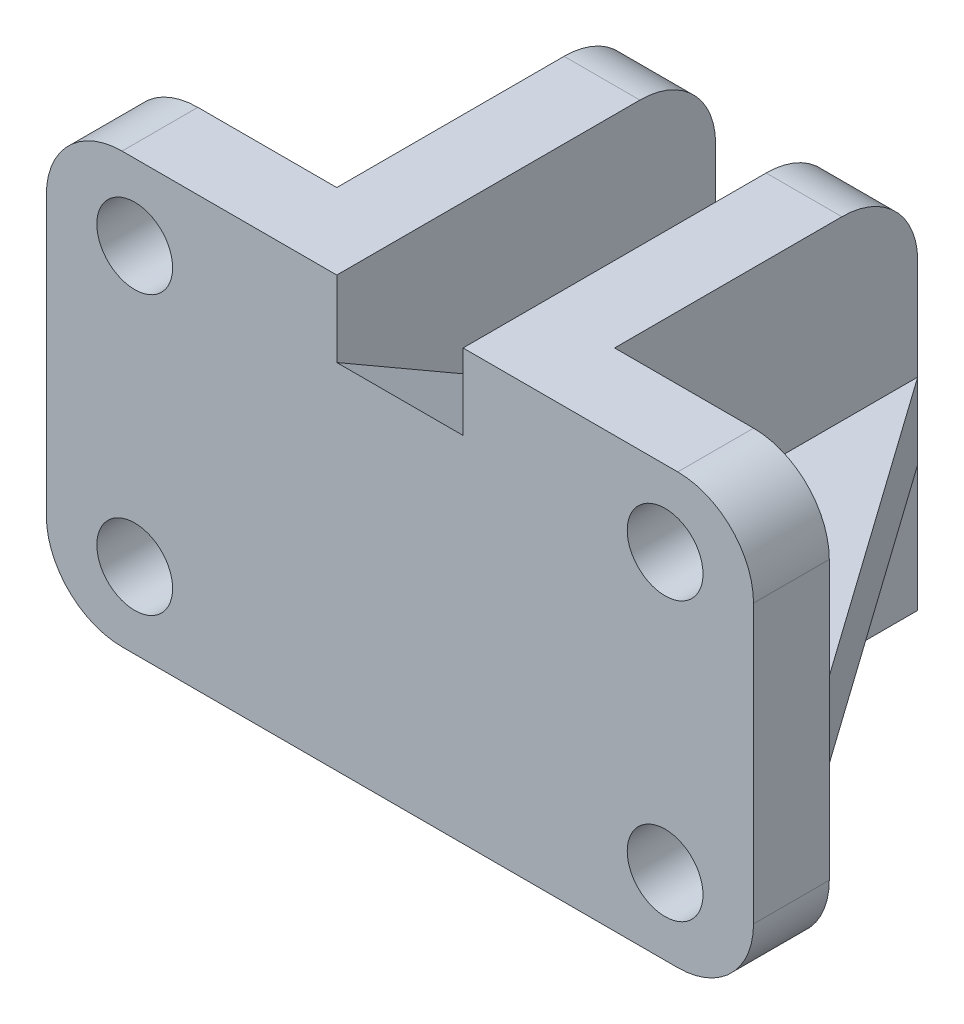
ISO-10303-21;
HEADER;
FILE_DESCRIPTION(('STEP AP214'),'2;1');
FILE_NAME('part.step','',(''),(''),'','','');
FILE_SCHEMA(('AUTOMOTIVE_DESIGN { 1 0 10303 214 1 1 1 1 }'));
ENDSEC;
DATA;
#1=APPLICATION_CONTEXT('core data for automotive mechanical design processes');
#2=APPLICATION_PROTOCOL_DEFINITION('international standard','automotive_design',2000,#1);
#3=PRODUCT_CONTEXT('',#1,'mechanical');
#4=PRODUCT('Part','Part','',(#3));
#5=PRODUCT_RELATED_PRODUCT_CATEGORY('part','',(#4));
#6=PRODUCT_DEFINITION_FORMATION('','',#4);
#7=PRODUCT_DEFINITION_CONTEXT('part definition',#1,'design');
#8=PRODUCT_DEFINITION('design','',#6,#7);
#9=PRODUCT_DEFINITION_SHAPE('','',#8);
#10=(LENGTH_UNIT() NAMED_UNIT(*) SI_UNIT(.MILLI.,.METRE.));
#11=(NAMED_UNIT(*) PLANE_ANGLE_UNIT() SI_UNIT($,.RADIAN.));
#12=(NAMED_UNIT(*) SI_UNIT($,.STERADIAN.) SOLID_ANGLE_UNIT());
#13=UNCERTAINTY_MEASURE_WITH_UNIT(LENGTH_MEASURE(1.E-05),#10,'distance_accuracy_value','');
#14=(GEOMETRIC_REPRESENTATION_CONTEXT(3) GLOBAL_UNCERTAINTY_ASSIGNED_CONTEXT((#13)) GLOBAL_UNIT_ASSIGNED_CONTEXT((#10,
#11,#12)) REPRESENTATION_CONTEXT('',''));
#15=CARTESIAN_POINT('',(0.,0.,0.));
#16=DIRECTION('',(0.,0.,1.));
#17=DIRECTION('',(1.,0.,0.));
#18=AXIS2_PLACEMENT_3D('',#15,#16,#17);
#19=CARTESIAN_POINT('',(5.5,1.57179676972459,-12.));
#20=DIRECTION('',(0.,0.,1.));
#21=DIRECTION('',(0.,-1.,0.));
#22=AXIS2_PLACEMENT_3D('',#19,#20,#21);
#23=PLANE('',#22);
#24=DIRECTION('',(-1.,0.,0.));
#25=VECTOR('',#24,1.);
#26=CARTESIAN_POINT('',(5.5,-6.49999999999999,-12.));
#27=LINE('',#26,#25);
#28=CARTESIAN_POINT('',(5.5,-6.49999999999999,-12.));
#29=VERTEX_POINT('',#28);
#30=CARTESIAN_POINT('',(2.5,-6.49999999999999,-12.));
#31=VERTEX_POINT('',#30);
#32=EDGE_CURVE('E249',#29,#31,#27,.T.);
#33=ORIENTED_EDGE('',*,*,#32,.T.);
#34=DIRECTION('',(0.,1.,0.));
#35=VECTOR('',#34,1.);
#36=CARTESIAN_POINT('',(2.5,1.57179676972459,-12.));
#37=LINE('',#36,#35);
#38=CARTESIAN_POINT('',(2.5,5.5,-12.));
#39=VERTEX_POINT('',#38);
#40=EDGE_CURVE('E365',#31,#39,#37,.T.);
#41=ORIENTED_EDGE('',*,*,#40,.T.);
#42=DIRECTION('',(-1.,0.,0.));
#43=VECTOR('',#42,1.);
#44=CARTESIAN_POINT('',(5.5,5.5,-12.));
#45=LINE('',#44,#43);
#46=CARTESIAN_POINT('',(5.5,5.5,-12.));
#47=VERTEX_POINT('',#46);
#48=EDGE_CURVE('E327',#39,#47,#45,.F.);
#49=ORIENTED_EDGE('',*,*,#48,.T.);
#50=DIRECTION('',(0.,1.,0.));
#51=VECTOR('',#50,1.);
#52=CARTESIAN_POINT('',(5.5,1.57179676972459,-12.));
#53=LINE('',#52,#51);
#54=CARTESIAN_POINT('',(5.5,1.5,-12.));
#55=VERTEX_POINT('',#54);
#56=EDGE_CURVE('E465',#55,#47,#53,.T.);
#57=ORIENTED_EDGE('',*,*,#56,.F.);
#58=CARTESIAN_POINT('',(5.5,-1.5,-12.));
#59=VERTEX_POINT('',#58);
#60=EDGE_CURVE('E470',#59,#55,#53,.T.);
#61=ORIENTED_EDGE('',*,*,#60,.F.);
#62=EDGE_CURVE('E241',#29,#59,#53,.T.);
#63=ORIENTED_EDGE('',*,*,#62,.F.);
#64=EDGE_LOOP('',(#33,#41,#49,#57,#61,#63));
#65=FACE_BOUND('',#64,.T.);
#66=ADVANCED_FACE('F34',(#65),#23,.F.);
#67=CARTESIAN_POINT('',(-14.,8.5,3.));
#68=DIRECTION('',(0.,-1.,0.));
#69=DIRECTION('',(0.,0.,-1.));
#70=AXIS2_PLACEMENT_3D('',#67,#68,#69);
#71=PLANE('',#70);
#72=DIRECTION('',(0.,0.,1.));
#73=VECTOR('',#72,1.);
#74=CARTESIAN_POINT('',(5.5,8.5,0.));
#75=LINE('',#74,#73);
#76=CARTESIAN_POINT('',(5.5,8.5,-9.));
#77=VERTEX_POINT('',#76);
#78=CARTESIAN_POINT('',(5.5,8.5,0.));
#79=VERTEX_POINT('',#78);
#80=EDGE_CURVE('E217',#77,#79,#75,.T.);
#81=ORIENTED_EDGE('',*,*,#80,.F.);
#82=DIRECTION('',(-1.,0.,0.));
#83=VECTOR('',#82,1.);
#84=CARTESIAN_POINT('',(-14.,8.5,-9.));
#85=LINE('',#84,#83);
#86=CARTESIAN_POINT('',(2.5,8.5,-9.));
#87=VERTEX_POINT('',#86);
#88=EDGE_CURVE('E333',#77,#87,#85,.T.);
#89=ORIENTED_EDGE('',*,*,#88,.T.);
#90=DIRECTION('',(0.,0.,1.));
#91=VECTOR('',#90,1.);
#92=CARTESIAN_POINT('',(2.5,8.5,3.));
#93=LINE('',#92,#91);
#94=CARTESIAN_POINT('',(2.5,8.5,3.));
#95=VERTEX_POINT('',#94);
#96=EDGE_CURVE('E457',#87,#95,#93,.T.);
#97=ORIENTED_EDGE('',*,*,#96,.T.);
#98=DIRECTION('',(-1.,0.,0.));
#99=VECTOR('',#98,1.);
#100=CARTESIAN_POINT('',(-14.,8.5,3.));
#101=LINE('',#100,#99);
#102=CARTESIAN_POINT('',(11.,8.5,3.));
#103=VERTEX_POINT('',#102);
#104=EDGE_CURVE('E262',#103,#95,#101,.T.);
#105=ORIENTED_EDGE('',*,*,#104,.F.);
#106=DIRECTION('',(0.,0.,-1.));
#107=VECTOR('',#106,1.);
#108=CARTESIAN_POINT('',(11.,8.5,3.));
#109=LINE('',#108,#107);
#110=CARTESIAN_POINT('',(11.,8.5,0.));
#111=VERTEX_POINT('',#110);
#112=EDGE_CURVE('E308',#103,#111,#109,.T.);
#113=ORIENTED_EDGE('',*,*,#112,.T.);
#114=DIRECTION('',(-1.,0.,0.));
#115=VECTOR('',#114,1.);
#116=CARTESIAN_POINT('',(-14.,8.5,0.));
#117=LINE('',#116,#115);
#118=EDGE_CURVE('E227',#111,#79,#117,.T.);
#119=ORIENTED_EDGE('',*,*,#118,.T.);
#120=EDGE_LOOP('',(#81,#89,#97,#105,#113,#119));
#121=FACE_BOUND('',#120,.T.);
#122=ADVANCED_FACE('F376',(#121),#71,.F.);
#123=CARTESIAN_POINT('',(0.,0.,0.));
#124=DIRECTION('',(0.,0.,1.));
#125=DIRECTION('',(1.,0.,0.));
#126=AXIS2_PLACEMENT_3D('',#123,#124,#125);
#127=PLANE('',#126);
#128=CARTESIAN_POINT('',(10.5,-5.5,0.));
#129=DIRECTION('',(0.,0.,-1.));
#130=DIRECTION('',(-1.,0.,0.));
#131=AXIS2_PLACEMENT_3D('',#128,#129,#130);
#132=CIRCLE('',#131,1.5);
#133=CARTESIAN_POINT('',(9.,-5.5,0.));
#134=VERTEX_POINT('',#133);
#135=EDGE_CURVE('E536',#134,#134,#132,.T.);
#136=ORIENTED_EDGE('',*,*,#135,.F.);
#137=EDGE_LOOP('',(#136));
#138=FACE_BOUND('',#137,.T.);
#139=CARTESIAN_POINT('',(-10.5,-5.5,0.));
#140=DIRECTION('',(0.,0.,-1.));
#141=DIRECTION('',(-1.,0.,0.));
#142=AXIS2_PLACEMENT_3D('',#139,#140,#141);
#143=CIRCLE('',#142,1.5);
#144=CARTESIAN_POINT('',(-12.,-5.5,0.));
#145=VERTEX_POINT('',#144);
#146=EDGE_CURVE('E539',#145,#145,#143,.T.);
#147=ORIENTED_EDGE('',*,*,#146,.F.);
#148=EDGE_LOOP('',(#147));
#149=FACE_BOUND('',#148,.T.);
#150=DIRECTION('',(1.,0.,0.));
#151=VECTOR('',#150,1.);
#152=CARTESIAN_POINT('',(-14.,-8.5,0.));
#153=LINE('',#152,#151);
#154=CARTESIAN_POINT('',(-11.,-8.5,0.));
#155=VERTEX_POINT('',#154);
#156=CARTESIAN_POINT('',(11.,-8.5,0.));
#157=VERTEX_POINT('',#156);
#158=EDGE_CURVE('E261',#155,#157,#153,.T.);
#159=ORIENTED_EDGE('',*,*,#158,.F.);
#160=CARTESIAN_POINT('',(-11.,-5.5,0.));
#161=DIRECTION('',(0.,0.,1.));
#162=DIRECTION('',(1.,0.,0.));
#163=AXIS2_PLACEMENT_3D('',#160,#161,#162);
#164=CIRCLE('',#163,3.);
#165=CARTESIAN_POINT('',(-14.,-5.5,0.));
#166=VERTEX_POINT('',#165);
#167=EDGE_CURVE('E301',#155,#166,#164,.F.);
#168=ORIENTED_EDGE('',*,*,#167,.T.);
#169=DIRECTION('',(0.,-1.,0.));
#170=VECTOR('',#169,1.);
#171=CARTESIAN_POINT('',(-14.,8.5,0.));
#172=LINE('',#171,#170);
#173=CARTESIAN_POINT('',(-14.,-1.5,0.));
#174=VERTEX_POINT('',#173);
#175=EDGE_CURVE('E274',#174,#166,#172,.T.);
#176=ORIENTED_EDGE('',*,*,#175,.F.);
#177=DIRECTION('',(-1.,0.,0.));
#178=VECTOR('',#177,1.);
#179=CARTESIAN_POINT('',(0.,-1.5,0.));
#180=LINE('',#179,#178);
#181=CARTESIAN_POINT('',(-5.5,-1.5,0.));
#182=VERTEX_POINT('',#181);
#183=EDGE_CURVE('E492',#182,#174,#180,.T.);
#184=ORIENTED_EDGE('',*,*,#183,.F.);
#185=DIRECTION('',(0.,-1.,0.));
#186=VECTOR('',#185,1.);
#187=CARTESIAN_POINT('',(-5.5,-6.5,0.));
#188=LINE('',#187,#186);
#189=CARTESIAN_POINT('',(-5.5,-6.5,0.));
#190=VERTEX_POINT('',#189);
#191=EDGE_CURVE('E234',#182,#190,#188,.T.);
#192=ORIENTED_EDGE('',*,*,#191,.T.);
#193=DIRECTION('',(-1.,0.,0.));
#194=VECTOR('',#193,1.);
#195=CARTESIAN_POINT('',(5.5,-6.5,0.));
#196=LINE('',#195,#194);
#197=CARTESIAN_POINT('',(5.5,-6.5,0.));
#198=VERTEX_POINT('',#197);
#199=EDGE_CURVE('E252',#198,#190,#196,.T.);
#200=ORIENTED_EDGE('',*,*,#199,.F.);
#201=DIRECTION('',(0.,-1.,0.));
#202=VECTOR('',#201,1.);
#203=CARTESIAN_POINT('',(5.5,1.57179676972459,0.));
#204=LINE('',#203,#202);
#205=CARTESIAN_POINT('',(5.5,-1.5,0.));
#206=VERTEX_POINT('',#205);
#207=EDGE_CURVE('E247',#206,#198,#204,.T.);
#208=ORIENTED_EDGE('',*,*,#207,.F.);
#209=DIRECTION('',(-1.,0.,0.));
#210=VECTOR('',#209,1.);
#211=CARTESIAN_POINT('',(0.,-1.5,0.));
#212=LINE('',#211,#210);
#213=CARTESIAN_POINT('',(14.,-1.5,0.));
#214=VERTEX_POINT('',#213);
#215=EDGE_CURVE('E514',#214,#206,#212,.T.);
#216=ORIENTED_EDGE('',*,*,#215,.F.);
#217=DIRECTION('',(0.,1.,0.));
#218=VECTOR('',#217,1.);
#219=CARTESIAN_POINT('',(14.,8.5,0.));
#220=LINE('',#219,#218);
#221=CARTESIAN_POINT('',(14.,-5.5,0.));
#222=VERTEX_POINT('',#221);
#223=EDGE_CURVE('E228',#222,#214,#220,.T.);
#224=ORIENTED_EDGE('',*,*,#223,.F.);
#225=CARTESIAN_POINT('',(11.,-5.5,0.));
#226=DIRECTION('',(0.,0.,1.));
#227=DIRECTION('',(1.,0.,0.));
#228=AXIS2_PLACEMENT_3D('',#225,#226,#227);
#229=CIRCLE('',#228,3.);
#230=EDGE_CURVE('E299',#222,#157,#229,.F.);
#231=ORIENTED_EDGE('',*,*,#230,.T.);
#232=EDGE_LOOP('',(#159,#168,#176,#184,#192,#200,#208,#216,#224,#231));
#233=FACE_BOUND('',#232,.T.);
#234=ADVANCED_FACE('F383',(#138,#149,#233),#127,.F.);
#235=CARTESIAN_POINT('',(-5.5,0.,0.));
#236=DIRECTION('',(1.,0.,0.));
#237=DIRECTION('',(0.,0.,-1.));
#238=AXIS2_PLACEMENT_3D('',#235,#236,#237);
#239=PLANE('',#238);
#240=DIRECTION('',(0.,0.,1.));
#241=VECTOR('',#240,1.);
#242=CARTESIAN_POINT('',(-5.5,-1.5,0.));
#243=LINE('',#242,#241);
#244=CARTESIAN_POINT('',(-5.5,-1.5,-12.));
#245=VERTEX_POINT('',#244);
#246=EDGE_CURVE('E487',#245,#182,#243,.T.);
#247=ORIENTED_EDGE('',*,*,#246,.F.);
#248=DIRECTION('',(0.,1.,0.));
#249=VECTOR('',#248,1.);
#250=CARTESIAN_POINT('',(-5.5,1.57179676972459,-12.));
#251=LINE('',#250,#249);
#252=CARTESIAN_POINT('',(-5.5,-6.49999999999999,-12.));
#253=VERTEX_POINT('',#252);
#254=EDGE_CURVE('E244',#253,#245,#251,.T.);
#255=ORIENTED_EDGE('',*,*,#254,.F.);
#256=DIRECTION('',(0.,0.,-1.));
#257=VECTOR('',#256,1.);
#258=CARTESIAN_POINT('',(-5.5,-6.49999999999999,-12.));
#259=LINE('',#258,#257);
#260=EDGE_CURVE('E233',#190,#253,#259,.T.);
#261=ORIENTED_EDGE('',*,*,#260,.F.);
#262=ORIENTED_EDGE('',*,*,#191,.F.);
#263=EDGE_LOOP('',(#247,#255,#261,#262));
#264=FACE_BOUND('',#263,.T.);
#265=ADVANCED_FACE('F485',(#264),#239,.F.);
#266=CARTESIAN_POINT('',(10.5,5.5,0.));
#267=DIRECTION('',(0.,0.,-1.));
#268=DIRECTION('',(-1.,0.,0.));
#269=AXIS2_PLACEMENT_3D('',#266,#267,#268);
#270=CIRCLE('',#269,1.5);
#271=CARTESIAN_POINT('',(9.,5.5,0.));
#272=VERTEX_POINT('',#271);
#273=EDGE_CURVE('E545',#272,#272,#270,.T.);
#274=ORIENTED_EDGE('',*,*,#273,.F.);
#275=EDGE_LOOP('',(#274));
#276=FACE_BOUND('',#275,.T.);
#277=ORIENTED_EDGE('',*,*,#118,.F.);
#278=CARTESIAN_POINT('',(11.,5.5,0.));
#279=DIRECTION('',(0.,0.,1.));
#280=DIRECTION('',(1.,0.,0.));
#281=AXIS2_PLACEMENT_3D('',#278,#279,#280);
#282=CIRCLE('',#281,3.);
#283=CARTESIAN_POINT('',(14.,5.50000000000001,0.));
#284=VERTEX_POINT('',#283);
#285=EDGE_CURVE('E311',#111,#284,#282,.F.);
#286=ORIENTED_EDGE('',*,*,#285,.T.);
#287=CARTESIAN_POINT('',(14.,1.5,0.));
#288=VERTEX_POINT('',#287);
#289=EDGE_CURVE('E256',#288,#284,#220,.T.);
#290=ORIENTED_EDGE('',*,*,#289,.F.);
#291=DIRECTION('',(-1.,0.,0.));
#292=VECTOR('',#291,1.);
#293=CARTESIAN_POINT('',(0.,1.5,0.));
#294=LINE('',#293,#292);
#295=CARTESIAN_POINT('',(5.5,1.5,0.));
#296=VERTEX_POINT('',#295);
#297=EDGE_CURVE('E518',#288,#296,#294,.T.);
#298=ORIENTED_EDGE('',*,*,#297,.T.);
#299=EDGE_CURVE('E462',#79,#296,#204,.T.);
#300=ORIENTED_EDGE('',*,*,#299,.F.);
#301=EDGE_LOOP('',(#277,#286,#290,#298,#300));
#302=FACE_BOUND('',#301,.T.);
#303=ADVANCED_FACE('F403',(#276,#302),#127,.F.);
#304=CARTESIAN_POINT('',(5.5,0.,0.));
#305=DIRECTION('',(1.,0.,0.));
#306=DIRECTION('',(0.,0.,-1.));
#307=AXIS2_PLACEMENT_3D('',#304,#305,#306);
#308=PLANE('',#307);
#309=ORIENTED_EDGE('',*,*,#62,.T.);
#310=DIRECTION('',(0.,0.,1.));
#311=VECTOR('',#310,1.);
#312=CARTESIAN_POINT('',(5.5,-1.5,0.));
#313=LINE('',#312,#311);
#314=EDGE_CURVE('E510',#59,#206,#313,.T.);
#315=ORIENTED_EDGE('',*,*,#314,.T.);
#316=ORIENTED_EDGE('',*,*,#207,.T.);
#317=DIRECTION('',(0.,0.,-1.));
#318=VECTOR('',#317,1.);
#319=CARTESIAN_POINT('',(5.5,-6.49999999999999,-12.));
#320=LINE('',#319,#318);
#321=EDGE_CURVE('E464',#198,#29,#320,.T.);
#322=ORIENTED_EDGE('',*,*,#321,.T.);
#323=EDGE_LOOP('',(#309,#315,#316,#322));
#324=FACE_BOUND('',#323,.T.);
#325=ADVANCED_FACE('F397',(#324),#308,.T.);
#326=CARTESIAN_POINT('',(0.,0.,3.));
#327=DIRECTION('',(0.,0.,1.));
#328=DIRECTION('',(1.,0.,0.));
#329=AXIS2_PLACEMENT_3D('',#326,#327,#328);
#330=PLANE('',#329);
#331=CARTESIAN_POINT('',(10.5,-5.5,3.));
#332=DIRECTION('',(0.,0.,1.));
#333=DIRECTION('',(1.,0.,0.));
#334=AXIS2_PLACEMENT_3D('',#331,#332,#333);
#335=CIRCLE('',#334,1.5);
#336=CARTESIAN_POINT('',(12.,-5.5,3.));
#337=VERTEX_POINT('',#336);
#338=EDGE_CURVE('E320',#337,#337,#335,.T.);
#339=ORIENTED_EDGE('',*,*,#338,.F.);
#340=EDGE_LOOP('',(#339));
#341=FACE_BOUND('',#340,.T.);
#342=CARTESIAN_POINT('',(-10.5,-5.5,3.));
#343=DIRECTION('',(0.,0.,1.));
#344=DIRECTION('',(1.,0.,0.));
#345=AXIS2_PLACEMENT_3D('',#342,#343,#344);
#346=CIRCLE('',#345,1.5);
#347=CARTESIAN_POINT('',(-9.,-5.5,3.));
#348=VERTEX_POINT('',#347);
#349=EDGE_CURVE('E316',#348,#348,#346,.T.);
#350=ORIENTED_EDGE('',*,*,#349,.F.);
#351=EDGE_LOOP('',(#350));
#352=FACE_BOUND('',#351,.T.);
#353=CARTESIAN_POINT('',(-10.5,5.5,3.));
#354=DIRECTION('',(0.,0.,1.));
#355=DIRECTION('',(1.,0.,0.));
#356=AXIS2_PLACEMENT_3D('',#353,#354,#355);
#357=CIRCLE('',#356,1.5);
#358=CARTESIAN_POINT('',(-9.,5.5,3.));
#359=VERTEX_POINT('',#358);
#360=EDGE_CURVE('E317',#359,#359,#357,.T.);
#361=ORIENTED_EDGE('',*,*,#360,.F.);
#362=EDGE_LOOP('',(#361));
#363=FACE_BOUND('',#362,.T.);
#364=CARTESIAN_POINT('',(10.5,5.5,3.));
#365=DIRECTION('',(0.,0.,1.));
#366=DIRECTION('',(1.,0.,0.));
#367=AXIS2_PLACEMENT_3D('',#364,#365,#366);
#368=CIRCLE('',#367,1.5);
#369=CARTESIAN_POINT('',(12.,5.5,3.));
#370=VERTEX_POINT('',#369);
#371=EDGE_CURVE('E313',#370,#370,#368,.T.);
#372=ORIENTED_EDGE('',*,*,#371,.F.);
#373=EDGE_LOOP('',(#372));
#374=FACE_BOUND('',#373,.T.);
#375=CARTESIAN_POINT('',(-2.5,8.5,3.));
#376=VERTEX_POINT('',#375);
#377=CARTESIAN_POINT('',(-11.,8.5,3.));
#378=VERTEX_POINT('',#377);
#379=EDGE_CURVE('E260',#376,#378,#101,.T.);
#380=ORIENTED_EDGE('',*,*,#379,.T.);
#381=CARTESIAN_POINT('',(-11.,5.5,3.));
#382=DIRECTION('',(0.,0.,1.));
#383=DIRECTION('',(1.,0.,0.));
#384=AXIS2_PLACEMENT_3D('',#381,#382,#383);
#385=CIRCLE('',#384,3.);
#386=CARTESIAN_POINT('',(-14.,5.5,3.));
#387=VERTEX_POINT('',#386);
#388=EDGE_CURVE('E292',#378,#387,#385,.T.);
#389=ORIENTED_EDGE('',*,*,#388,.T.);
#390=DIRECTION('',(0.,-1.,0.));
#391=VECTOR('',#390,1.);
#392=CARTESIAN_POINT('',(-14.,8.5,3.));
#393=LINE('',#392,#391);
#394=CARTESIAN_POINT('',(-14.,-5.5,3.));
#395=VERTEX_POINT('',#394);
#396=EDGE_CURVE('E265',#387,#395,#393,.T.);
#397=ORIENTED_EDGE('',*,*,#396,.T.);
#398=CARTESIAN_POINT('',(-11.,-5.5,3.));
#399=DIRECTION('',(0.,0.,1.));
#400=DIRECTION('',(1.,0.,0.));
#401=AXIS2_PLACEMENT_3D('',#398,#399,#400);
#402=CIRCLE('',#401,3.);
#403=CARTESIAN_POINT('',(-11.,-8.5,3.));
#404=VERTEX_POINT('',#403);
#405=EDGE_CURVE('E290',#395,#404,#402,.T.);
#406=ORIENTED_EDGE('',*,*,#405,.T.);
#407=DIRECTION('',(1.,0.,0.));
#408=VECTOR('',#407,1.);
#409=CARTESIAN_POINT('',(-14.,-8.5,3.));
#410=LINE('',#409,#408);
#411=CARTESIAN_POINT('',(11.,-8.5,3.));
#412=VERTEX_POINT('',#411);
#413=EDGE_CURVE('E268',#404,#412,#410,.T.);
#414=ORIENTED_EDGE('',*,*,#413,.T.);
#415=CARTESIAN_POINT('',(11.,-5.5,3.));
#416=DIRECTION('',(0.,0.,1.));
#417=DIRECTION('',(1.,0.,0.));
#418=AXIS2_PLACEMENT_3D('',#415,#416,#417);
#419=CIRCLE('',#418,3.);
#420=CARTESIAN_POINT('',(14.,-5.5,3.));
#421=VERTEX_POINT('',#420);
#422=EDGE_CURVE('E288',#412,#421,#419,.T.);
#423=ORIENTED_EDGE('',*,*,#422,.T.);
#424=DIRECTION('',(0.,1.,0.));
#425=VECTOR('',#424,1.);
#426=CARTESIAN_POINT('',(14.,8.5,3.));
#427=LINE('',#426,#425);
#428=CARTESIAN_POINT('',(14.,5.50000000000001,3.));
#429=VERTEX_POINT('',#428);
#430=EDGE_CURVE('E257',#421,#429,#427,.T.);
#431=ORIENTED_EDGE('',*,*,#430,.T.);
#432=CARTESIAN_POINT('',(11.,5.5,3.));
#433=DIRECTION('',(0.,0.,1.));
#434=DIRECTION('',(1.,0.,0.));
#435=AXIS2_PLACEMENT_3D('',#432,#433,#434);
#436=CIRCLE('',#435,3.);
#437=EDGE_CURVE('E286',#429,#103,#436,.T.);
#438=ORIENTED_EDGE('',*,*,#437,.T.);
#439=ORIENTED_EDGE('',*,*,#104,.T.);
#440=DIRECTION('',(0.,-1.,0.));
#441=VECTOR('',#440,1.);
#442=CARTESIAN_POINT('',(2.5,10.2320508075689,3.));
#443=LINE('',#442,#441);
#444=CARTESIAN_POINT('',(2.5,5.5,3.));
#445=VERTEX_POINT('',#444);
#446=EDGE_CURVE('E366',#95,#445,#443,.T.);
#447=ORIENTED_EDGE('',*,*,#446,.T.);
#448=DIRECTION('',(1.,0.,0.));
#449=VECTOR('',#448,1.);
#450=CARTESIAN_POINT('',(-2.5,5.5,3.));
#451=LINE('',#450,#449);
#452=CARTESIAN_POINT('',(-2.5,5.5,3.));
#453=VERTEX_POINT('',#452);
#454=EDGE_CURVE('E363',#453,#445,#451,.T.);
#455=ORIENTED_EDGE('',*,*,#454,.F.);
#456=DIRECTION('',(0.,-1.,0.));
#457=VECTOR('',#456,1.);
#458=CARTESIAN_POINT('',(-2.5,10.2320508075689,3.));
#459=LINE('',#458,#457);
#460=EDGE_CURVE('E524',#376,#453,#459,.T.);
#461=ORIENTED_EDGE('',*,*,#460,.F.);
#462=EDGE_LOOP('',(#380,#389,#397,#406,#414,#423,#431,#438,#439,#447,#455,#461));
#463=FACE_BOUND('',#462,.T.);
#464=ADVANCED_FACE('F390',(#341,#352,#363,#374,#463),#330,.T.);
#465=DIRECTION('',(0.,1.,0.));
#466=VECTOR('',#465,1.);
#467=CARTESIAN_POINT('',(-2.5,1.57179676972459,-12.));
#468=LINE('',#467,#466);
#469=CARTESIAN_POINT('',(-2.5,-6.49999999999999,-12.));
#470=VERTEX_POINT('',#469);
#471=CARTESIAN_POINT('',(-2.5,5.5,-12.));
#472=VERTEX_POINT('',#471);
#473=EDGE_CURVE('E49',#470,#472,#468,.T.);
#474=ORIENTED_EDGE('',*,*,#473,.F.);
#475=EDGE_CURVE('E253',#470,#253,#27,.T.);
#476=ORIENTED_EDGE('',*,*,#475,.T.);
#477=ORIENTED_EDGE('',*,*,#254,.T.);
#478=CARTESIAN_POINT('',(-5.5,1.5,-12.));
#479=VERTEX_POINT('',#478);
#480=EDGE_CURVE('E248',#245,#479,#251,.T.);
#481=ORIENTED_EDGE('',*,*,#480,.T.);
#482=CARTESIAN_POINT('',(-5.5,5.5,-12.));
#483=VERTEX_POINT('',#482);
#484=EDGE_CURVE('E237',#479,#483,#251,.T.);
#485=ORIENTED_EDGE('',*,*,#484,.T.);
#486=DIRECTION('',(-1.,0.,0.));
#487=VECTOR('',#486,1.);
#488=CARTESIAN_POINT('',(5.5,5.5,-12.));
#489=LINE('',#488,#487);
#490=EDGE_CURVE('E329',#483,#472,#489,.F.);
#491=ORIENTED_EDGE('',*,*,#490,.T.);
#492=EDGE_LOOP('',(#474,#476,#477,#481,#485,#491));
#493=FACE_BOUND('',#492,.T.);
#494=ADVANCED_FACE('F379',(#493),#23,.F.);
#495=CARTESIAN_POINT('',(14.,8.5,3.));
#496=DIRECTION('',(-1.,0.,0.));
#497=DIRECTION('',(0.,-1.,0.));
#498=AXIS2_PLACEMENT_3D('',#495,#496,#497);
#499=PLANE('',#498);
#500=ORIENTED_EDGE('',*,*,#430,.F.);
#501=DIRECTION('',(0.,0.,-1.));
#502=VECTOR('',#501,1.);
#503=CARTESIAN_POINT('',(14.,-5.5,3.));
#504=LINE('',#503,#502);
#505=EDGE_CURVE('E305',#421,#222,#504,.T.);
#506=ORIENTED_EDGE('',*,*,#505,.T.);
#507=ORIENTED_EDGE('',*,*,#223,.T.);
#508=DIRECTION('',(0.,-1.,0.));
#509=VECTOR('',#508,1.);
#510=CARTESIAN_POINT('',(14.,0.,0.));
#511=LINE('',#510,#509);
#512=EDGE_CURVE('E521',#214,#288,#511,.F.);
#513=ORIENTED_EDGE('',*,*,#512,.T.);
#514=ORIENTED_EDGE('',*,*,#289,.T.);
#515=DIRECTION('',(0.,0.,-1.));
#516=VECTOR('',#515,1.);
#517=CARTESIAN_POINT('',(14.,5.50000000000001,3.));
#518=LINE('',#517,#516);
#519=EDGE_CURVE('E303',#284,#429,#518,.F.);
#520=ORIENTED_EDGE('',*,*,#519,.T.);
#521=EDGE_LOOP('',(#500,#506,#507,#513,#514,#520));
#522=FACE_BOUND('',#521,.T.);
#523=ADVANCED_FACE('F389',(#522),#499,.F.);
#524=DIRECTION('',(0.,0.,1.));
#525=VECTOR('',#524,1.);
#526=CARTESIAN_POINT('',(-2.5,8.5,3.));
#527=LINE('',#526,#525);
#528=CARTESIAN_POINT('',(-2.5,8.5,-9.));
#529=VERTEX_POINT('',#528);
#530=EDGE_CURVE('E239',#529,#376,#527,.T.);
#531=ORIENTED_EDGE('',*,*,#530,.F.);
#532=DIRECTION('',(-1.,0.,0.));
#533=VECTOR('',#532,1.);
#534=CARTESIAN_POINT('',(-14.,8.5,-9.));
#535=LINE('',#534,#533);
#536=CARTESIAN_POINT('',(-5.5,8.5,-9.));
#537=VERTEX_POINT('',#536);
#538=EDGE_CURVE('E214',#529,#537,#535,.T.);
#539=ORIENTED_EDGE('',*,*,#538,.T.);
#540=DIRECTION('',(0.,0.,1.));
#541=VECTOR('',#540,1.);
#542=CARTESIAN_POINT('',(-5.5,8.5,0.));
#543=LINE('',#542,#541);
#544=CARTESIAN_POINT('',(-5.5,8.5,0.));
#545=VERTEX_POINT('',#544);
#546=EDGE_CURVE('E207',#537,#545,#543,.T.);
#547=ORIENTED_EDGE('',*,*,#546,.T.);
#548=CARTESIAN_POINT('',(-11.,8.5,0.));
#549=VERTEX_POINT('',#548);
#550=EDGE_CURVE('E211',#545,#549,#117,.T.);
#551=ORIENTED_EDGE('',*,*,#550,.T.);
#552=DIRECTION('',(0.,0.,-1.));
#553=VECTOR('',#552,1.);
#554=CARTESIAN_POINT('',(-11.,8.5,3.));
#555=LINE('',#554,#553);
#556=EDGE_CURVE('E284',#549,#378,#555,.F.);
#557=ORIENTED_EDGE('',*,*,#556,.T.);
#558=ORIENTED_EDGE('',*,*,#379,.F.);
#559=EDGE_LOOP('',(#531,#539,#547,#551,#557,#558));
#560=FACE_BOUND('',#559,.T.);
#561=ADVANCED_FACE('F210',(#560),#71,.F.);
#562=CARTESIAN_POINT('',(-14.,8.5,3.));
#563=DIRECTION('',(1.,0.,0.));
#564=DIRECTION('',(0.,1.,0.));
#565=AXIS2_PLACEMENT_3D('',#562,#563,#564);
#566=PLANE('',#565);
#567=ORIENTED_EDGE('',*,*,#396,.F.);
#568=DIRECTION('',(0.,0.,-1.));
#569=VECTOR('',#568,1.);
#570=CARTESIAN_POINT('',(-14.,5.5,3.));
#571=LINE('',#570,#569);
#572=CARTESIAN_POINT('',(-14.,5.5,0.));
#573=VERTEX_POINT('',#572);
#574=EDGE_CURVE('E280',#387,#573,#571,.T.);
#575=ORIENTED_EDGE('',*,*,#574,.T.);
#576=CARTESIAN_POINT('',(-14.,1.5,0.));
#577=VERTEX_POINT('',#576);
#578=EDGE_CURVE('E275',#573,#577,#172,.T.);
#579=ORIENTED_EDGE('',*,*,#578,.T.);
#580=DIRECTION('',(0.,-1.,0.));
#581=VECTOR('',#580,1.);
#582=CARTESIAN_POINT('',(-14.,0.,0.));
#583=LINE('',#582,#581);
#584=EDGE_CURVE('E503',#577,#174,#583,.T.);
#585=ORIENTED_EDGE('',*,*,#584,.T.);
#586=ORIENTED_EDGE('',*,*,#175,.T.);
#587=DIRECTION('',(0.,0.,-1.));
#588=VECTOR('',#587,1.);
#589=CARTESIAN_POINT('',(-14.,-5.5,3.));
#590=LINE('',#589,#588);
#591=EDGE_CURVE('E271',#166,#395,#590,.F.);
#592=ORIENTED_EDGE('',*,*,#591,.T.);
#593=EDGE_LOOP('',(#567,#575,#579,#585,#586,#592));
#594=FACE_BOUND('',#593,.T.);
#595=ADVANCED_FACE('F417',(#594),#566,.F.);
#596=CARTESIAN_POINT('',(-14.,-8.5,3.));
#597=DIRECTION('',(0.,1.,0.));
#598=DIRECTION('',(0.,0.,1.));
#599=AXIS2_PLACEMENT_3D('',#596,#597,#598);
#600=PLANE('',#599);
#601=ORIENTED_EDGE('',*,*,#413,.F.);
#602=DIRECTION('',(0.,0.,-1.));
#603=VECTOR('',#602,1.);
#604=CARTESIAN_POINT('',(-11.,-8.5,3.));
#605=LINE('',#604,#603);
#606=EDGE_CURVE('E296',#404,#155,#605,.T.);
#607=ORIENTED_EDGE('',*,*,#606,.T.);
#608=ORIENTED_EDGE('',*,*,#158,.T.);
#609=DIRECTION('',(0.,0.,-1.));
#610=VECTOR('',#609,1.);
#611=CARTESIAN_POINT('',(11.,-8.5,3.));
#612=LINE('',#611,#610);
#613=EDGE_CURVE('E294',#157,#412,#612,.F.);
#614=ORIENTED_EDGE('',*,*,#613,.T.);
#615=EDGE_LOOP('',(#601,#607,#608,#614));
#616=FACE_BOUND('',#615,.T.);
#617=ADVANCED_FACE('F413',(#616),#600,.F.);
#618=CARTESIAN_POINT('',(-10.5,5.5,0.));
#619=DIRECTION('',(0.,0.,-1.));
#620=DIRECTION('',(-1.,0.,0.));
#621=AXIS2_PLACEMENT_3D('',#618,#619,#620);
#622=CIRCLE('',#621,1.5);
#623=CARTESIAN_POINT('',(-12.,5.5,0.));
#624=VERTEX_POINT('',#623);
#625=EDGE_CURVE('E542',#624,#624,#622,.T.);
#626=ORIENTED_EDGE('',*,*,#625,.F.);
#627=EDGE_LOOP('',(#626));
#628=FACE_BOUND('',#627,.T.);
#629=ORIENTED_EDGE('',*,*,#578,.F.);
#630=CARTESIAN_POINT('',(-11.,5.5,0.));
#631=DIRECTION('',(0.,0.,1.));
#632=DIRECTION('',(1.,0.,0.));
#633=AXIS2_PLACEMENT_3D('',#630,#631,#632);
#634=CIRCLE('',#633,3.);
#635=EDGE_CURVE('E226',#573,#549,#634,.F.);
#636=ORIENTED_EDGE('',*,*,#635,.T.);
#637=ORIENTED_EDGE('',*,*,#550,.F.);
#638=CARTESIAN_POINT('',(-5.5,1.5,0.));
#639=VERTEX_POINT('',#638);
#640=EDGE_CURVE('E224',#545,#639,#188,.T.);
#641=ORIENTED_EDGE('',*,*,#640,.T.);
#642=DIRECTION('',(-1.,0.,0.));
#643=VECTOR('',#642,1.);
#644=CARTESIAN_POINT('',(0.,1.5,0.));
#645=LINE('',#644,#643);
#646=EDGE_CURVE('E501',#639,#577,#645,.T.);
#647=ORIENTED_EDGE('',*,*,#646,.T.);
#648=EDGE_LOOP('',(#629,#636,#637,#641,#647));
#649=FACE_BOUND('',#648,.T.);
#650=ADVANCED_FACE('F222',(#628,#649),#127,.F.);
#651=CARTESIAN_POINT('',(5.5,-6.49999999999999,-12.));
#652=DIRECTION('',(0.,1.,0.));
#653=DIRECTION('',(0.,0.,1.));
#654=AXIS2_PLACEMENT_3D('',#651,#652,#653);
#655=PLANE('',#654);
#656=DIRECTION('',(1.,0.,0.));
#657=VECTOR('',#656,1.);
#658=CARTESIAN_POINT('',(0.,-6.49999999999999,-11.6993210164651));
#659=LINE('',#658,#657);
#660=CARTESIAN_POINT('',(-2.5,-6.49999999999999,-11.6993210164651));
#661=VERTEX_POINT('',#660);
#662=CARTESIAN_POINT('',(2.5,-6.49999999999999,-11.6993210164651));
#663=VERTEX_POINT('',#662);
#664=EDGE_CURVE('E343',#661,#663,#659,.T.);
#665=ORIENTED_EDGE('',*,*,#664,.T.);
#666=DIRECTION('',(0.,0.,-1.));
#667=VECTOR('',#666,1.);
#668=CARTESIAN_POINT('',(2.5,-6.49999999999999,-12.));
#669=LINE('',#668,#667);
#670=EDGE_CURVE('E346',#663,#31,#669,.T.);
#671=ORIENTED_EDGE('',*,*,#670,.T.);
#672=ORIENTED_EDGE('',*,*,#32,.F.);
#673=ORIENTED_EDGE('',*,*,#321,.F.);
#674=ORIENTED_EDGE('',*,*,#199,.T.);
#675=ORIENTED_EDGE('',*,*,#260,.T.);
#676=ORIENTED_EDGE('',*,*,#475,.F.);
#677=DIRECTION('',(0.,0.,1.));
#678=VECTOR('',#677,1.);
#679=CARTESIAN_POINT('',(-2.5,-6.5,0.));
#680=LINE('',#679,#678);
#681=EDGE_CURVE('E340',#470,#661,#680,.T.);
#682=ORIENTED_EDGE('',*,*,#681,.T.);
#683=EDGE_LOOP('',(#665,#671,#672,#673,#674,#675,#676,#682));
#684=FACE_BOUND('',#683,.T.);
#685=ADVANCED_FACE('F410',(#684),#655,.F.);
#686=ORIENTED_EDGE('',*,*,#56,.T.);
#687=CARTESIAN_POINT('',(5.5,5.5,-9.));
#688=DIRECTION('',(1.,0.,0.));
#689=DIRECTION('',(0.,0.,-1.));
#690=AXIS2_PLACEMENT_3D('',#687,#688,#689);
#691=CIRCLE('',#690,3.);
#692=EDGE_CURVE('E338',#47,#77,#691,.T.);
#693=ORIENTED_EDGE('',*,*,#692,.T.);
#694=ORIENTED_EDGE('',*,*,#80,.T.);
#695=ORIENTED_EDGE('',*,*,#299,.T.);
#696=DIRECTION('',(0.,0.,1.));
#697=VECTOR('',#696,1.);
#698=CARTESIAN_POINT('',(5.5,1.5,0.));
#699=LINE('',#698,#697);
#700=EDGE_CURVE('E516',#55,#296,#699,.T.);
#701=ORIENTED_EDGE('',*,*,#700,.F.);
#702=EDGE_LOOP('',(#686,#693,#694,#695,#701));
#703=FACE_BOUND('',#702,.T.);
#704=ADVANCED_FACE('F406',(#703),#308,.T.);
#705=ORIENTED_EDGE('',*,*,#546,.F.);
#706=CARTESIAN_POINT('',(-5.5,5.5,-9.));
#707=DIRECTION('',(1.,0.,0.));
#708=DIRECTION('',(0.,0.,-1.));
#709=AXIS2_PLACEMENT_3D('',#706,#707,#708);
#710=CIRCLE('',#709,3.);
#711=EDGE_CURVE('E325',#537,#483,#710,.F.);
#712=ORIENTED_EDGE('',*,*,#711,.T.);
#713=ORIENTED_EDGE('',*,*,#484,.F.);
#714=DIRECTION('',(0.,0.,1.));
#715=VECTOR('',#714,1.);
#716=CARTESIAN_POINT('',(-5.5,1.5,0.));
#717=LINE('',#716,#715);
#718=EDGE_CURVE('E232',#479,#639,#717,.T.);
#719=ORIENTED_EDGE('',*,*,#718,.T.);
#720=ORIENTED_EDGE('',*,*,#640,.F.);
#721=EDGE_LOOP('',(#705,#712,#713,#719,#720));
#722=FACE_BOUND('',#721,.T.);
#723=ADVANCED_FACE('F230',(#722),#239,.F.);
#724=CARTESIAN_POINT('',(-2.5,0.,0.));
#725=DIRECTION('',(1.,0.,0.));
#726=DIRECTION('',(0.,0.,-1.));
#727=AXIS2_PLACEMENT_3D('',#724,#725,#726);
#728=PLANE('',#727);
#729=ORIENTED_EDGE('',*,*,#473,.T.);
#730=CARTESIAN_POINT('',(-2.5,5.5,-9.));
#731=DIRECTION('',(1.,0.,0.));
#732=DIRECTION('',(0.,0.,-1.));
#733=AXIS2_PLACEMENT_3D('',#730,#731,#732);
#734=CIRCLE('',#733,3.);
#735=EDGE_CURVE('E331',#472,#529,#734,.T.);
#736=ORIENTED_EDGE('',*,*,#735,.T.);
#737=ORIENTED_EDGE('',*,*,#530,.T.);
#738=ORIENTED_EDGE('',*,*,#460,.T.);
#739=DIRECTION('',(0.,-0.499999999999994,-0.866025403784442));
#740=VECTOR('',#739,1.);
#741=CARTESIAN_POINT('',(-2.5,3.76794919243115,0.));
#742=LINE('',#741,#740);
#743=CARTESIAN_POINT('',(-2.5,-0.273502691896139,-6.99999999999995));
#744=VERTEX_POINT('',#743);
#745=EDGE_CURVE('E526',#453,#744,#742,.T.);
#746=ORIENTED_EDGE('',*,*,#745,.T.);
#747=CARTESIAN_POINT('',(-2.5,-8.93375672974056,-2.));
#748=DIRECTION('',(1.,0.,0.));
#749=DIRECTION('',(0.,0.,-1.));
#750=AXIS2_PLACEMENT_3D('',#747,#748,#749);
#751=CIRCLE('',#750,10.);
#752=EDGE_CURVE('E11',#744,#661,#751,.F.);
#753=ORIENTED_EDGE('',*,*,#752,.T.);
#754=ORIENTED_EDGE('',*,*,#681,.F.);
#755=EDGE_LOOP('',(#729,#736,#737,#738,#746,#753,#754));
#756=FACE_BOUND('',#755,.T.);
#757=ADVANCED_FACE('F453',(#756),#728,.T.);
#758=CARTESIAN_POINT('',(2.5,0.,0.));
#759=DIRECTION('',(1.,0.,0.));
#760=DIRECTION('',(0.,0.,-1.));
#761=AXIS2_PLACEMENT_3D('',#758,#759,#760);
#762=PLANE('',#761);
#763=ORIENTED_EDGE('',*,*,#96,.F.);
#764=CARTESIAN_POINT('',(2.5,5.5,-9.));
#765=DIRECTION('',(1.,0.,0.));
#766=DIRECTION('',(0.,0.,-1.));
#767=AXIS2_PLACEMENT_3D('',#764,#765,#766);
#768=CIRCLE('',#767,3.);
#769=EDGE_CURVE('E336',#87,#39,#768,.F.);
#770=ORIENTED_EDGE('',*,*,#769,.T.);
#771=ORIENTED_EDGE('',*,*,#40,.F.);
#772=ORIENTED_EDGE('',*,*,#670,.F.);
#773=CARTESIAN_POINT('',(2.5,-8.93375672974056,-2.));
#774=DIRECTION('',(1.,0.,0.));
#775=DIRECTION('',(0.,0.,-1.));
#776=AXIS2_PLACEMENT_3D('',#773,#774,#775);
#777=CIRCLE('',#776,10.);
#778=CARTESIAN_POINT('',(2.5,-0.273502691896141,-6.99999999999995));
#779=VERTEX_POINT('',#778);
#780=EDGE_CURVE('E42',#663,#779,#777,.T.);
#781=ORIENTED_EDGE('',*,*,#780,.T.);
#782=DIRECTION('',(0.,-0.499999999999995,-0.866025403784442));
#783=VECTOR('',#782,1.);
#784=CARTESIAN_POINT('',(2.5,-3.16025403784426,-12.));
#785=LINE('',#784,#783);
#786=EDGE_CURVE('E356',#445,#779,#785,.T.);
#787=ORIENTED_EDGE('',*,*,#786,.F.);
#788=ORIENTED_EDGE('',*,*,#446,.F.);
#789=EDGE_LOOP('',(#763,#770,#771,#772,#781,#787,#788));
#790=FACE_BOUND('',#789,.T.);
#791=ADVANCED_FACE('F354',(#790),#762,.F.);
#792=CARTESIAN_POINT('',(-2.5,-3.16025403784426,-12.));
#793=DIRECTION('',(0.,-0.866025403784442,0.499999999999995));
#794=DIRECTION('',(0.,-0.499999999999995,-0.866025403784442));
#795=AXIS2_PLACEMENT_3D('',#792,#793,#794);
#796=PLANE('',#795);
#797=ORIENTED_EDGE('',*,*,#786,.T.);
#798=DIRECTION('',(1.,0.,0.));
#799=VECTOR('',#798,1.);
#800=CARTESIAN_POINT('',(-2.5,-0.273502691896141,-6.99999999999995));
#801=LINE('',#800,#799);
#802=EDGE_CURVE('E349',#779,#744,#801,.F.);
#803=ORIENTED_EDGE('',*,*,#802,.T.);
#804=ORIENTED_EDGE('',*,*,#745,.F.);
#805=ORIENTED_EDGE('',*,*,#454,.T.);
#806=EDGE_LOOP('',(#797,#803,#804,#805));
#807=FACE_BOUND('',#806,.T.);
#808=ADVANCED_FACE('F359',(#807),#796,.F.);
#809=CARTESIAN_POINT('',(5.5,0.,-12.));
#810=DIRECTION('',(-0.816024481101655,0.,0.578017340780339));
#811=DIRECTION('',(0.578017340780339,0.,0.816024481101655));
#812=AXIS2_PLACEMENT_3D('',#809,#810,#811);
#813=PLANE('',#812);
#814=ORIENTED_EDGE('',*,*,#512,.F.);
#815=DIRECTION('',(0.578017340780339,0.,0.816024481101655));
#816=VECTOR('',#815,1.);
#817=CARTESIAN_POINT('',(5.5,-1.5,-12.));
#818=LINE('',#817,#816);
#819=EDGE_CURVE('E506',#59,#214,#818,.T.);
#820=ORIENTED_EDGE('',*,*,#819,.F.);
#821=ORIENTED_EDGE('',*,*,#60,.T.);
#822=DIRECTION('',(0.578017340780339,0.,0.816024481101655));
#823=VECTOR('',#822,1.);
#824=CARTESIAN_POINT('',(5.5,1.5,-12.));
#825=LINE('',#824,#823);
#826=EDGE_CURVE('E507',#55,#288,#825,.T.);
#827=ORIENTED_EDGE('',*,*,#826,.T.);
#828=EDGE_LOOP('',(#814,#820,#821,#827));
#829=FACE_BOUND('',#828,.T.);
#830=ADVANCED_FACE('F584',(#829),#813,.F.);
#831=CARTESIAN_POINT('',(0.,1.5,-4.5));
#832=DIRECTION('',(0.,1.,0.));
#833=DIRECTION('',(0.,0.,1.));
#834=AXIS2_PLACEMENT_3D('',#831,#832,#833);
#835=PLANE('',#834);
#836=ORIENTED_EDGE('',*,*,#297,.F.);
#837=ORIENTED_EDGE('',*,*,#826,.F.);
#838=ORIENTED_EDGE('',*,*,#700,.T.);
#839=EDGE_LOOP('',(#836,#837,#838));
#840=FACE_BOUND('',#839,.T.);
#841=ADVANCED_FACE('F581',(#840),#835,.T.);
#842=CARTESIAN_POINT('',(0.,-1.5,-4.5));
#843=DIRECTION('',(0.,1.,0.));
#844=DIRECTION('',(0.,0.,1.));
#845=AXIS2_PLACEMENT_3D('',#842,#843,#844);
#846=PLANE('',#845);
#847=ORIENTED_EDGE('',*,*,#819,.T.);
#848=ORIENTED_EDGE('',*,*,#215,.T.);
#849=ORIENTED_EDGE('',*,*,#314,.F.);
#850=EDGE_LOOP('',(#847,#848,#849));
#851=FACE_BOUND('',#850,.T.);
#852=ADVANCED_FACE('F576',(#851),#846,.F.);
#853=CARTESIAN_POINT('',(-5.5,0.,-12.));
#854=DIRECTION('',(-0.816024481101655,0.,-0.578017340780339));
#855=DIRECTION('',(-0.578017340780339,0.,0.816024481101655));
#856=AXIS2_PLACEMENT_3D('',#853,#854,#855);
#857=PLANE('',#856);
#858=ORIENTED_EDGE('',*,*,#584,.F.);
#859=DIRECTION('',(-0.578017340780339,0.,0.816024481101655));
#860=VECTOR('',#859,1.);
#861=CARTESIAN_POINT('',(-5.5,1.5,-12.));
#862=LINE('',#861,#860);
#863=EDGE_CURVE('E493',#479,#577,#862,.T.);
#864=ORIENTED_EDGE('',*,*,#863,.F.);
#865=ORIENTED_EDGE('',*,*,#480,.F.);
#866=DIRECTION('',(-0.578017340780339,0.,0.816024481101655));
#867=VECTOR('',#866,1.);
#868=CARTESIAN_POINT('',(-5.5,-1.5,-12.));
#869=LINE('',#868,#867);
#870=EDGE_CURVE('E323',#245,#174,#869,.T.);
#871=ORIENTED_EDGE('',*,*,#870,.T.);
#872=EDGE_LOOP('',(#858,#864,#865,#871));
#873=FACE_BOUND('',#872,.T.);
#874=ADVANCED_FACE('F566',(#873),#857,.T.);
#875=CARTESIAN_POINT('',(0.,1.5,-4.5));
#876=DIRECTION('',(0.,1.,0.));
#877=DIRECTION('',(0.,0.,1.));
#878=AXIS2_PLACEMENT_3D('',#875,#876,#877);
#879=PLANE('',#878);
#880=ORIENTED_EDGE('',*,*,#646,.F.);
#881=ORIENTED_EDGE('',*,*,#718,.F.);
#882=ORIENTED_EDGE('',*,*,#863,.T.);
#883=EDGE_LOOP('',(#880,#881,#882));
#884=FACE_BOUND('',#883,.T.);
#885=ADVANCED_FACE('F568',(#884),#879,.T.);
#886=CARTESIAN_POINT('',(0.,-1.5,-4.5));
#887=DIRECTION('',(0.,1.,0.));
#888=DIRECTION('',(0.,0.,1.));
#889=AXIS2_PLACEMENT_3D('',#886,#887,#888);
#890=PLANE('',#889);
#891=ORIENTED_EDGE('',*,*,#246,.T.);
#892=ORIENTED_EDGE('',*,*,#183,.T.);
#893=ORIENTED_EDGE('',*,*,#870,.F.);
#894=EDGE_LOOP('',(#891,#892,#893));
#895=FACE_BOUND('',#894,.T.);
#896=ADVANCED_FACE('F427',(#895),#890,.F.);
#897=CARTESIAN_POINT('',(-11.,5.5,3.));
#898=DIRECTION('',(0.,0.,-1.));
#899=DIRECTION('',(-1.,0.,0.));
#900=AXIS2_PLACEMENT_3D('',#897,#898,#899);
#901=CYLINDRICAL_SURFACE('',#900,3.);
#902=ORIENTED_EDGE('',*,*,#388,.F.);
#903=ORIENTED_EDGE('',*,*,#556,.F.);
#904=ORIENTED_EDGE('',*,*,#635,.F.);
#905=ORIENTED_EDGE('',*,*,#574,.F.);
#906=EDGE_LOOP('',(#902,#903,#904,#905));
#907=FACE_BOUND('',#906,.T.);
#908=ADVANCED_FACE('F423',(#907),#901,.T.);
#909=CARTESIAN_POINT('',(-11.,-5.5,3.));
#910=DIRECTION('',(0.,0.,-1.));
#911=DIRECTION('',(-1.,0.,0.));
#912=AXIS2_PLACEMENT_3D('',#909,#910,#911);
#913=CYLINDRICAL_SURFACE('',#912,3.);
#914=ORIENTED_EDGE('',*,*,#405,.F.);
#915=ORIENTED_EDGE('',*,*,#591,.F.);
#916=ORIENTED_EDGE('',*,*,#167,.F.);
#917=ORIENTED_EDGE('',*,*,#606,.F.);
#918=EDGE_LOOP('',(#914,#915,#916,#917));
#919=FACE_BOUND('',#918,.T.);
#920=ADVANCED_FACE('F426',(#919),#913,.T.);
#921=CARTESIAN_POINT('',(11.,-5.5,3.));
#922=DIRECTION('',(0.,0.,-1.));
#923=DIRECTION('',(-1.,0.,0.));
#924=AXIS2_PLACEMENT_3D('',#921,#922,#923);
#925=CYLINDRICAL_SURFACE('',#924,3.);
#926=ORIENTED_EDGE('',*,*,#422,.F.);
#927=ORIENTED_EDGE('',*,*,#613,.F.);
#928=ORIENTED_EDGE('',*,*,#230,.F.);
#929=ORIENTED_EDGE('',*,*,#505,.F.);
#930=EDGE_LOOP('',(#926,#927,#928,#929));
#931=FACE_BOUND('',#930,.T.);
#932=ADVANCED_FACE('F431',(#931),#925,.T.);
#933=CARTESIAN_POINT('',(11.,5.5,3.));
#934=DIRECTION('',(0.,0.,-1.));
#935=DIRECTION('',(-1.,0.,0.));
#936=AXIS2_PLACEMENT_3D('',#933,#934,#935);
#937=CYLINDRICAL_SURFACE('',#936,3.);
#938=ORIENTED_EDGE('',*,*,#437,.F.);
#939=ORIENTED_EDGE('',*,*,#519,.F.);
#940=ORIENTED_EDGE('',*,*,#285,.F.);
#941=ORIENTED_EDGE('',*,*,#112,.F.);
#942=EDGE_LOOP('',(#938,#939,#940,#941));
#943=FACE_BOUND('',#942,.T.);
#944=ADVANCED_FACE('F435',(#943),#937,.T.);
#945=CARTESIAN_POINT('',(-10.5,5.5,5.3));
#946=DIRECTION('',(0.,0.,-1.));
#947=DIRECTION('',(-1.,0.,0.));
#948=AXIS2_PLACEMENT_3D('',#945,#946,#947);
#949=CYLINDRICAL_SURFACE('',#948,1.5);
#950=ORIENTED_EDGE('',*,*,#360,.T.);
#951=EDGE_LOOP('',(#950));
#952=FACE_BOUND('',#951,.T.);
#953=ORIENTED_EDGE('',*,*,#625,.T.);
#954=EDGE_LOOP('',(#953));
#955=FACE_BOUND('',#954,.T.);
#956=ADVANCED_FACE('F439',(#952,#955),#949,.F.);
#957=CARTESIAN_POINT('',(10.5,5.5,5.3));
#958=DIRECTION('',(0.,0.,-1.));
#959=DIRECTION('',(-1.,0.,0.));
#960=AXIS2_PLACEMENT_3D('',#957,#958,#959);
#961=CYLINDRICAL_SURFACE('',#960,1.5);
#962=ORIENTED_EDGE('',*,*,#371,.T.);
#963=EDGE_LOOP('',(#962));
#964=FACE_BOUND('',#963,.T.);
#965=ORIENTED_EDGE('',*,*,#273,.T.);
#966=EDGE_LOOP('',(#965));
#967=FACE_BOUND('',#966,.T.);
#968=ADVANCED_FACE('F579',(#964,#967),#961,.F.);
#969=CARTESIAN_POINT('',(-10.5,-5.5,5.3));
#970=DIRECTION('',(0.,0.,-1.));
#971=DIRECTION('',(-1.,0.,0.));
#972=AXIS2_PLACEMENT_3D('',#969,#970,#971);
#973=CYLINDRICAL_SURFACE('',#972,1.5);
#974=ORIENTED_EDGE('',*,*,#349,.T.);
#975=EDGE_LOOP('',(#974));
#976=FACE_BOUND('',#975,.T.);
#977=ORIENTED_EDGE('',*,*,#146,.T.);
#978=EDGE_LOOP('',(#977));
#979=FACE_BOUND('',#978,.T.);
#980=ADVANCED_FACE('F447',(#976,#979),#973,.F.);
#981=CARTESIAN_POINT('',(10.5,-5.5,5.3));
#982=DIRECTION('',(0.,0.,-1.));
#983=DIRECTION('',(-1.,0.,0.));
#984=AXIS2_PLACEMENT_3D('',#981,#982,#983);
#985=CYLINDRICAL_SURFACE('',#984,1.5);
#986=ORIENTED_EDGE('',*,*,#338,.T.);
#987=EDGE_LOOP('',(#986));
#988=FACE_BOUND('',#987,.T.);
#989=ORIENTED_EDGE('',*,*,#135,.T.);
#990=EDGE_LOOP('',(#989));
#991=FACE_BOUND('',#990,.T.);
#992=ADVANCED_FACE('F442',(#988,#991),#985,.F.);
#993=CARTESIAN_POINT('',(-14.,5.5,-9.));
#994=DIRECTION('',(-1.,0.,0.));
#995=DIRECTION('',(0.,0.,1.));
#996=AXIS2_PLACEMENT_3D('',#993,#994,#995);
#997=CYLINDRICAL_SURFACE('',#996,3.);
#998=ORIENTED_EDGE('',*,*,#735,.F.);
#999=ORIENTED_EDGE('',*,*,#490,.F.);
#1000=ORIENTED_EDGE('',*,*,#711,.F.);
#1001=ORIENTED_EDGE('',*,*,#538,.F.);
#1002=EDGE_LOOP('',(#998,#999,#1000,#1001));
#1003=FACE_BOUND('',#1002,.T.);
#1004=ADVANCED_FACE('F373',(#1003),#997,.T.);
#1005=CARTESIAN_POINT('',(-14.,5.5,-9.));
#1006=DIRECTION('',(-1.,0.,0.));
#1007=DIRECTION('',(0.,0.,1.));
#1008=AXIS2_PLACEMENT_3D('',#1005,#1006,#1007);
#1009=CYLINDRICAL_SURFACE('',#1008,3.);
#1010=ORIENTED_EDGE('',*,*,#692,.F.);
#1011=ORIENTED_EDGE('',*,*,#48,.F.);
#1012=ORIENTED_EDGE('',*,*,#769,.F.);
#1013=ORIENTED_EDGE('',*,*,#88,.F.);
#1014=EDGE_LOOP('',(#1010,#1011,#1012,#1013));
#1015=FACE_BOUND('',#1014,.T.);
#1016=ADVANCED_FACE('F369',(#1015),#1009,.T.);
#1017=CARTESIAN_POINT('',(5.5,-8.93375672974056,-2.));
#1018=DIRECTION('',(1.,0.,0.));
#1019=DIRECTION('',(0.,0.,-1.));
#1020=AXIS2_PLACEMENT_3D('',#1017,#1018,#1019);
#1021=CYLINDRICAL_SURFACE('',#1020,10.);
#1022=ORIENTED_EDGE('',*,*,#752,.F.);
#1023=ORIENTED_EDGE('',*,*,#802,.F.);
#1024=ORIENTED_EDGE('',*,*,#780,.F.);
#1025=ORIENTED_EDGE('',*,*,#664,.F.);
#1026=EDGE_LOOP('',(#1022,#1023,#1024,#1025));
#1027=FACE_BOUND('',#1026,.T.);
#1028=ADVANCED_FACE('F36',(#1027),#1021,.T.);
#1029=CLOSED_SHELL('',(#66,#122,#234,#265,#303,#325,#464,#494,#523,#561,#595,#617,#650,#685,
#704,#723,#757,#791,#808,#830,#841,#852,#874,#885,#896,#908,#920,#932,#944,#956,#968,#980,#992,
#1004,#1016,#1028));
#1030=MANIFOLD_SOLID_BREP('B2',#1029);
#1031=ADVANCED_BREP_SHAPE_REPRESENTATION('',(#18,#1030),#14);
#1032=SHAPE_DEFINITION_REPRESENTATION(#9,#1031);
ENDSEC;
END-ISO-10303-21;
